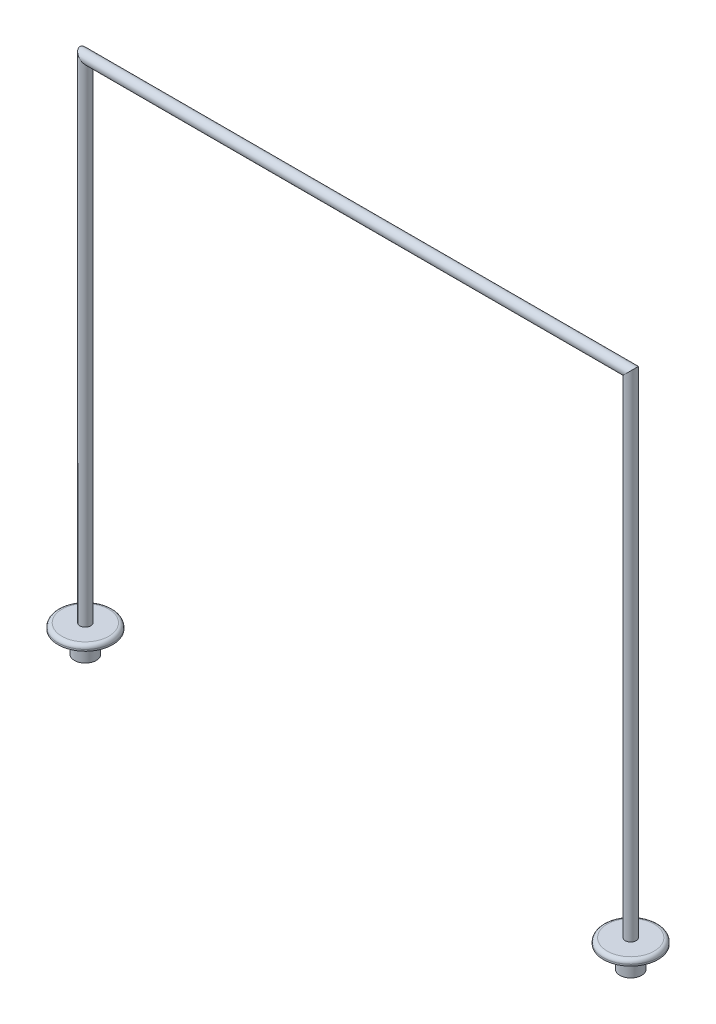
ISO-10303-21;
HEADER;
FILE_DESCRIPTION(('STEP AP214'),'2;1');
FILE_NAME('part.step','',(''),(''),'','','');
FILE_SCHEMA(('AUTOMOTIVE_DESIGN { 1 0 10303 214 1 1 1 1 }'));
ENDSEC;
DATA;
#1=APPLICATION_CONTEXT('core data for automotive mechanical design processes');
#2=APPLICATION_PROTOCOL_DEFINITION('international standard','automotive_design',2000,#1);
#3=PRODUCT_CONTEXT('',#1,'mechanical');
#4=PRODUCT('Part','Part','',(#3));
#5=PRODUCT_RELATED_PRODUCT_CATEGORY('part','',(#4));
#6=PRODUCT_DEFINITION_FORMATION('','',#4);
#7=PRODUCT_DEFINITION_CONTEXT('part definition',#1,'design');
#8=PRODUCT_DEFINITION('design','',#6,#7);
#9=PRODUCT_DEFINITION_SHAPE('','',#8);
#10=(LENGTH_UNIT() NAMED_UNIT(*) SI_UNIT(.MILLI.,.METRE.));
#11=(NAMED_UNIT(*) PLANE_ANGLE_UNIT() SI_UNIT($,.RADIAN.));
#12=(NAMED_UNIT(*) SI_UNIT($,.STERADIAN.) SOLID_ANGLE_UNIT());
#13=UNCERTAINTY_MEASURE_WITH_UNIT(LENGTH_MEASURE(1.E-05),#10,'distance_accuracy_value','');
#14=(GEOMETRIC_REPRESENTATION_CONTEXT(3) GLOBAL_UNCERTAINTY_ASSIGNED_CONTEXT((#13)) GLOBAL_UNIT_ASSIGNED_CONTEXT((#10,
#11,#12)) REPRESENTATION_CONTEXT('',''));
#15=CARTESIAN_POINT('',(0.,0.,0.));
#16=DIRECTION('',(0.,0.,1.));
#17=DIRECTION('',(1.,0.,0.));
#18=AXIS2_PLACEMENT_3D('',#15,#16,#17);
#19=CARTESIAN_POINT('',(100.,92.3,0.));
#20=DIRECTION('',(0.,-1.,0.));
#21=DIRECTION('',(1.,0.,0.));
#22=AXIS2_PLACEMENT_3D('',#19,#20,#21);
#23=CYLINDRICAL_SURFACE('',#22,1.);
#24=CARTESIAN_POINT('',(100.,90.,0.));
#25=DIRECTION('',(0.707106781186548,-0.707106781186547,0.));
#26=DIRECTION('',(0.707106781186547,0.707106781186548,0.));
#27=AXIS2_PLACEMENT_3D('',#24,#25,#26);
#28=ELLIPSE('',#27,1.41421356237309,1.);
#29=CARTESIAN_POINT('',(101.,91.,0.));
#30=VERTEX_POINT('',#29);
#31=EDGE_CURVE('E43',#30,#30,#28,.F.);
#32=ORIENTED_EDGE('',*,*,#31,.F.);
#33=EDGE_LOOP('',(#32));
#34=FACE_BOUND('',#33,.T.);
#35=CARTESIAN_POINT('',(100.,0.,0.));
#36=DIRECTION('',(0.,-1.,0.));
#37=DIRECTION('',(0.,0.,1.));
#38=AXIS2_PLACEMENT_3D('',#35,#36,#37);
#39=CIRCLE('',#38,1.);
#40=CARTESIAN_POINT('',(100.,0.,1.));
#41=VERTEX_POINT('',#40);
#42=EDGE_CURVE('E39',#41,#41,#39,.T.);
#43=ORIENTED_EDGE('',*,*,#42,.F.);
#44=EDGE_LOOP('',(#43));
#45=FACE_BOUND('',#44,.T.);
#46=ADVANCED_FACE('F36',(#34,#45),#23,.T.);
#47=CARTESIAN_POINT('',(-2.29999999999998,90.,0.));
#48=DIRECTION('',(1.,0.,0.));
#49=DIRECTION('',(0.,0.,-1.));
#50=AXIS2_PLACEMENT_3D('',#47,#48,#49);
#51=CYLINDRICAL_SURFACE('',#50,1.);
#52=CARTESIAN_POINT('',(0.,90.,0.));
#53=DIRECTION('',(0.707106781186547,0.707106781186547,0.));
#54=DIRECTION('',(-0.707106781186548,0.707106781186548,0.));
#55=AXIS2_PLACEMENT_3D('',#52,#53,#54);
#56=ELLIPSE('',#55,1.4142135623731,1.);
#57=CARTESIAN_POINT('',(-1.,91.,0.));
#58=VERTEX_POINT('',#57);
#59=EDGE_CURVE('E10',#58,#58,#56,.F.);
#60=ORIENTED_EDGE('',*,*,#59,.F.);
#61=EDGE_LOOP('',(#60));
#62=FACE_BOUND('',#61,.T.);
#63=ORIENTED_EDGE('',*,*,#31,.T.);
#64=EDGE_LOOP('',(#63));
#65=FACE_BOUND('',#64,.T.);
#66=ADVANCED_FACE('F105',(#62,#65),#51,.T.);
#67=CARTESIAN_POINT('',(0.,0.,0.));
#68=DIRECTION('',(0.,1.,0.));
#69=DIRECTION('',(0.,0.,1.));
#70=AXIS2_PLACEMENT_3D('',#67,#68,#69);
#71=CYLINDRICAL_SURFACE('',#70,1.);
#72=CARTESIAN_POINT('',(0.,0.,0.));
#73=DIRECTION('',(0.,-1.,0.));
#74=DIRECTION('',(0.,0.,-1.));
#75=AXIS2_PLACEMENT_3D('',#72,#73,#74);
#76=CIRCLE('',#75,1.);
#77=CARTESIAN_POINT('',(0.,0.,-1.));
#78=VERTEX_POINT('',#77);
#79=EDGE_CURVE('E49',#78,#78,#76,.F.);
#80=ORIENTED_EDGE('',*,*,#79,.T.);
#81=EDGE_LOOP('',(#80));
#82=FACE_BOUND('',#81,.T.);
#83=ORIENTED_EDGE('',*,*,#59,.T.);
#84=EDGE_LOOP('',(#83));
#85=FACE_BOUND('',#84,.T.);
#86=ADVANCED_FACE('F102',(#82,#85),#71,.T.);
#87=CARTESIAN_POINT('',(0.,-0.999999999999999,-5.));
#88=DIRECTION('',(0.,1.,0.));
#89=DIRECTION('',(0.,0.,1.));
#90=AXIS2_PLACEMENT_3D('',#87,#88,#89);
#91=PLANE('',#90);
#92=CARTESIAN_POINT('',(0.,-0.999999999999999,0.));
#93=DIRECTION('',(0.,-1.,0.));
#94=DIRECTION('',(0.,0.,-1.));
#95=AXIS2_PLACEMENT_3D('',#92,#93,#94);
#96=CIRCLE('',#95,2.);
#97=CARTESIAN_POINT('',(0.,-0.999999999999999,-2.));
#98=VERTEX_POINT('',#97);
#99=EDGE_CURVE('E52',#98,#98,#96,.T.);
#100=ORIENTED_EDGE('',*,*,#99,.F.);
#101=EDGE_LOOP('',(#100));
#102=FACE_BOUND('',#101,.T.);
#103=CARTESIAN_POINT('',(0.,-0.999999999999999,0.));
#104=DIRECTION('',(0.,-1.,0.));
#105=DIRECTION('',(0.,0.,-1.));
#106=AXIS2_PLACEMENT_3D('',#103,#104,#105);
#107=CIRCLE('',#106,5.);
#108=CARTESIAN_POINT('',(0.,-0.999999999999999,-5.));
#109=VERTEX_POINT('',#108);
#110=EDGE_CURVE('E56',#109,#109,#107,.T.);
#111=ORIENTED_EDGE('',*,*,#110,.T.);
#112=EDGE_LOOP('',(#111));
#113=FACE_BOUND('',#112,.T.);
#114=ADVANCED_FACE('F104',(#102,#113),#91,.F.);
#115=CARTESIAN_POINT('',(0.,0.,0.));
#116=DIRECTION('',(0.,-1.,0.));
#117=DIRECTION('',(0.,0.,-1.));
#118=AXIS2_PLACEMENT_3D('',#115,#116,#117);
#119=PLANE('',#118);
#120=ORIENTED_EDGE('',*,*,#79,.F.);
#121=EDGE_LOOP('',(#120));
#122=FACE_BOUND('',#121,.T.);
#123=CARTESIAN_POINT('',(0.,0.,0.));
#124=DIRECTION('',(0.,-1.,0.));
#125=DIRECTION('',(0.,0.,-1.));
#126=AXIS2_PLACEMENT_3D('',#123,#124,#125);
#127=CIRCLE('',#126,4.29999999999999);
#128=CARTESIAN_POINT('',(0.,0.,-4.29999999999999));
#129=VERTEX_POINT('',#128);
#130=EDGE_CURVE('E60',#129,#129,#127,.T.);
#131=ORIENTED_EDGE('',*,*,#130,.F.);
#132=EDGE_LOOP('',(#131));
#133=FACE_BOUND('',#132,.T.);
#134=ADVANCED_FACE('F112',(#122,#133),#119,.F.);
#135=CARTESIAN_POINT('',(0.,-0.7,0.));
#136=DIRECTION('',(0.,-1.,0.));
#137=DIRECTION('',(0.,0.,-1.));
#138=AXIS2_PLACEMENT_3D('',#135,#136,#137);
#139=TOROIDAL_SURFACE('',#138,4.3,0.7);
#140=CARTESIAN_POINT('',(0.,-0.700000000000005,0.));
#141=DIRECTION('',(0.,-1.,0.));
#142=DIRECTION('',(0.,0.,-1.));
#143=AXIS2_PLACEMENT_3D('',#140,#141,#142);
#144=CIRCLE('',#143,5.);
#145=CARTESIAN_POINT('',(0.,-0.700000000000005,-5.));
#146=VERTEX_POINT('',#145);
#147=EDGE_CURVE('E63',#146,#146,#144,.T.);
#148=ORIENTED_EDGE('',*,*,#147,.F.);
#149=EDGE_LOOP('',(#148));
#150=FACE_BOUND('',#149,.T.);
#151=ORIENTED_EDGE('',*,*,#130,.T.);
#152=EDGE_LOOP('',(#151));
#153=FACE_BOUND('',#152,.T.);
#154=ADVANCED_FACE('F129',(#150,#153),#139,.T.);
#155=CARTESIAN_POINT('',(0.,0.,0.));
#156=DIRECTION('',(0.,-1.,0.));
#157=DIRECTION('',(0.,0.,-1.));
#158=AXIS2_PLACEMENT_3D('',#155,#156,#157);
#159=CYLINDRICAL_SURFACE('',#158,5.);
#160=ORIENTED_EDGE('',*,*,#110,.F.);
#161=EDGE_LOOP('',(#160));
#162=FACE_BOUND('',#161,.T.);
#163=ORIENTED_EDGE('',*,*,#147,.T.);
#164=EDGE_LOOP('',(#163));
#165=FACE_BOUND('',#164,.T.);
#166=ADVANCED_FACE('F121',(#162,#165),#159,.T.);
#167=CARTESIAN_POINT('',(0.,-5.,0.));
#168=DIRECTION('',(0.,-1.,0.));
#169=DIRECTION('',(0.,0.,-1.));
#170=AXIS2_PLACEMENT_3D('',#167,#168,#169);
#171=PLANE('',#170);
#172=CARTESIAN_POINT('',(0.,-5.,0.));
#173=DIRECTION('',(0.,-1.,0.));
#174=DIRECTION('',(0.,0.,-1.));
#175=AXIS2_PLACEMENT_3D('',#172,#173,#174);
#176=CIRCLE('',#175,2.);
#177=CARTESIAN_POINT('',(0.,-5.,-2.));
#178=VERTEX_POINT('',#177);
#179=EDGE_CURVE('E53',#178,#178,#176,.T.);
#180=ORIENTED_EDGE('',*,*,#179,.T.);
#181=EDGE_LOOP('',(#180));
#182=FACE_BOUND('',#181,.T.);
#183=ADVANCED_FACE('F118',(#182),#171,.T.);
#184=CARTESIAN_POINT('',(0.,0.,0.));
#185=DIRECTION('',(0.,-1.,0.));
#186=DIRECTION('',(0.,0.,-1.));
#187=AXIS2_PLACEMENT_3D('',#184,#185,#186);
#188=CYLINDRICAL_SURFACE('',#187,2.);
#189=ORIENTED_EDGE('',*,*,#179,.F.);
#190=EDGE_LOOP('',(#189));
#191=FACE_BOUND('',#190,.T.);
#192=ORIENTED_EDGE('',*,*,#99,.T.);
#193=EDGE_LOOP('',(#192));
#194=FACE_BOUND('',#193,.T.);
#195=ADVANCED_FACE('F115',(#191,#194),#188,.T.);
#196=CARTESIAN_POINT('',(100.,0.,0.));
#197=DIRECTION('',(0.,-1.,0.));
#198=DIRECTION('',(0.,0.,-1.));
#199=AXIS2_PLACEMENT_3D('',#196,#197,#198);
#200=PLANE('',#199);
#201=ORIENTED_EDGE('',*,*,#42,.T.);
#202=EDGE_LOOP('',(#201));
#203=FACE_BOUND('',#202,.T.);
#204=CARTESIAN_POINT('',(100.,0.,0.));
#205=DIRECTION('',(0.,1.,0.));
#206=DIRECTION('',(0.,0.,-1.));
#207=AXIS2_PLACEMENT_3D('',#204,#205,#206);
#208=CIRCLE('',#207,4.29999999999999);
#209=CARTESIAN_POINT('',(100.,0.,-4.29999999999999));
#210=VERTEX_POINT('',#209);
#211=EDGE_CURVE('E74',#210,#210,#208,.T.);
#212=ORIENTED_EDGE('',*,*,#211,.T.);
#213=EDGE_LOOP('',(#212));
#214=FACE_BOUND('',#213,.T.);
#215=ADVANCED_FACE('F124',(#203,#214),#200,.F.);
#216=CARTESIAN_POINT('',(100.,-0.7,0.));
#217=DIRECTION('',(0.,-1.,0.));
#218=DIRECTION('',(0.,0.,-1.));
#219=AXIS2_PLACEMENT_3D('',#216,#217,#218);
#220=TOROIDAL_SURFACE('',#219,4.3,0.7);
#221=CARTESIAN_POINT('',(100.,-0.700000000000005,0.));
#222=DIRECTION('',(0.,1.,0.));
#223=DIRECTION('',(0.,0.,-1.));
#224=AXIS2_PLACEMENT_3D('',#221,#222,#223);
#225=CIRCLE('',#224,5.);
#226=CARTESIAN_POINT('',(100.,-0.700000000000005,-5.));
#227=VERTEX_POINT('',#226);
#228=EDGE_CURVE('E77',#227,#227,#225,.T.);
#229=ORIENTED_EDGE('',*,*,#228,.T.);
#230=EDGE_LOOP('',(#229));
#231=FACE_BOUND('',#230,.T.);
#232=ORIENTED_EDGE('',*,*,#211,.F.);
#233=EDGE_LOOP('',(#232));
#234=FACE_BOUND('',#233,.T.);
#235=ADVANCED_FACE('F98',(#231,#234),#220,.T.);
#236=CARTESIAN_POINT('',(100.,0.,0.));
#237=DIRECTION('',(0.,-1.,0.));
#238=DIRECTION('',(0.,0.,-1.));
#239=AXIS2_PLACEMENT_3D('',#236,#237,#238);
#240=CYLINDRICAL_SURFACE('',#239,5.);
#241=CARTESIAN_POINT('',(100.,-0.999999999999999,0.));
#242=DIRECTION('',(0.,1.,0.));
#243=DIRECTION('',(0.,0.,-1.));
#244=AXIS2_PLACEMENT_3D('',#241,#242,#243);
#245=CIRCLE('',#244,5.);
#246=CARTESIAN_POINT('',(100.,-0.999999999999999,-5.));
#247=VERTEX_POINT('',#246);
#248=EDGE_CURVE('E71',#247,#247,#245,.T.);
#249=ORIENTED_EDGE('',*,*,#248,.T.);
#250=EDGE_LOOP('',(#249));
#251=FACE_BOUND('',#250,.T.);
#252=ORIENTED_EDGE('',*,*,#228,.F.);
#253=EDGE_LOOP('',(#252));
#254=FACE_BOUND('',#253,.T.);
#255=ADVANCED_FACE('F83',(#251,#254),#240,.T.);
#256=CARTESIAN_POINT('',(100.,-0.999999999999999,-5.));
#257=DIRECTION('',(0.,1.,0.));
#258=DIRECTION('',(0.,0.,1.));
#259=AXIS2_PLACEMENT_3D('',#256,#257,#258);
#260=PLANE('',#259);
#261=CARTESIAN_POINT('',(100.,-0.999999999999999,0.));
#262=DIRECTION('',(0.,1.,0.));
#263=DIRECTION('',(0.,0.,-1.));
#264=AXIS2_PLACEMENT_3D('',#261,#262,#263);
#265=CIRCLE('',#264,2.);
#266=CARTESIAN_POINT('',(100.,-0.999999999999999,-2.));
#267=VERTEX_POINT('',#266);
#268=EDGE_CURVE('E57',#267,#267,#265,.T.);
#269=ORIENTED_EDGE('',*,*,#268,.T.);
#270=EDGE_LOOP('',(#269));
#271=FACE_BOUND('',#270,.T.);
#272=ORIENTED_EDGE('',*,*,#248,.F.);
#273=EDGE_LOOP('',(#272));
#274=FACE_BOUND('',#273,.T.);
#275=ADVANCED_FACE('F86',(#271,#274),#260,.F.);
#276=CARTESIAN_POINT('',(100.,-5.,0.));
#277=DIRECTION('',(0.,-1.,0.));
#278=DIRECTION('',(0.,0.,-1.));
#279=AXIS2_PLACEMENT_3D('',#276,#277,#278);
#280=PLANE('',#279);
#281=CARTESIAN_POINT('',(100.,-5.,0.));
#282=DIRECTION('',(0.,1.,0.));
#283=DIRECTION('',(0.,0.,-1.));
#284=AXIS2_PLACEMENT_3D('',#281,#282,#283);
#285=CIRCLE('',#284,2.);
#286=CARTESIAN_POINT('',(100.,-5.,-2.));
#287=VERTEX_POINT('',#286);
#288=EDGE_CURVE('E68',#287,#287,#285,.T.);
#289=ORIENTED_EDGE('',*,*,#288,.F.);
#290=EDGE_LOOP('',(#289));
#291=FACE_BOUND('',#290,.T.);
#292=ADVANCED_FACE('F88',(#291),#280,.T.);
#293=CARTESIAN_POINT('',(100.,0.,0.));
#294=DIRECTION('',(0.,-1.,0.));
#295=DIRECTION('',(0.,0.,-1.));
#296=AXIS2_PLACEMENT_3D('',#293,#294,#295);
#297=CYLINDRICAL_SURFACE('',#296,2.);
#298=ORIENTED_EDGE('',*,*,#288,.T.);
#299=EDGE_LOOP('',(#298));
#300=FACE_BOUND('',#299,.T.);
#301=ORIENTED_EDGE('',*,*,#268,.F.);
#302=EDGE_LOOP('',(#301));
#303=FACE_BOUND('',#302,.T.);
#304=ADVANCED_FACE('F95',(#300,#303),#297,.T.);
#305=CLOSED_SHELL('',(#46,#66,#86,#114,#134,#154,#166,#183,#195,#215,#235,#255,#275,#292,#304));
#306=MANIFOLD_SOLID_BREP('B2',#305);
#307=ADVANCED_BREP_SHAPE_REPRESENTATION('',(#18,#306),#14);
#308=SHAPE_DEFINITION_REPRESENTATION(#9,#307);
ENDSEC;
END-ISO-10303-21;
